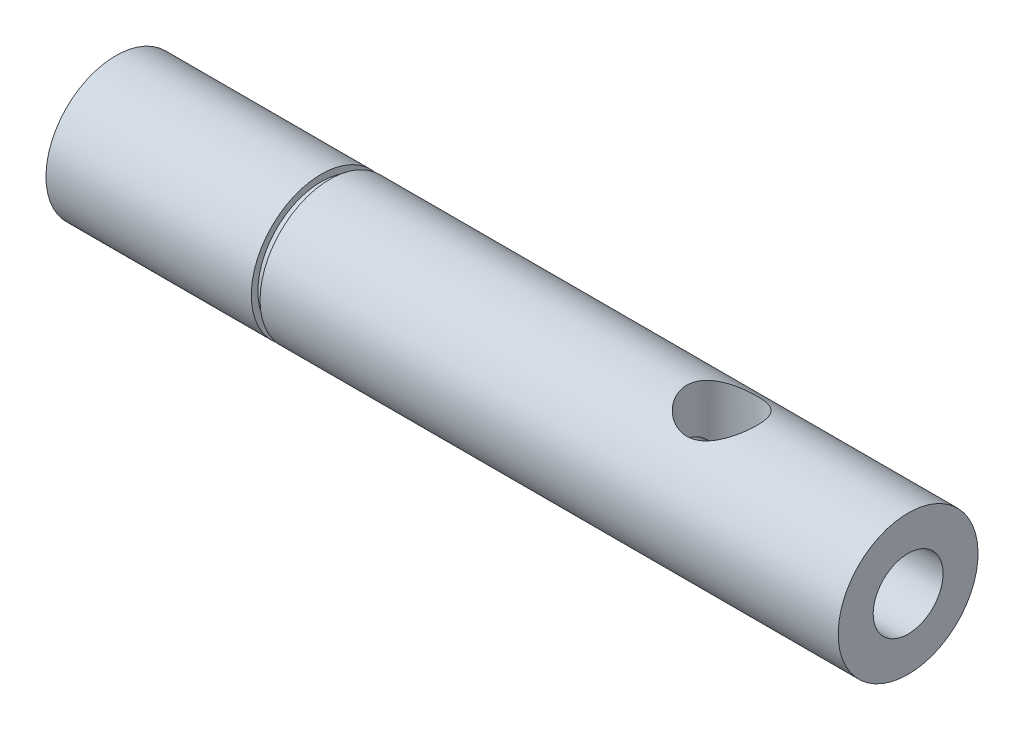
ISO-10303-21;
HEADER;
FILE_DESCRIPTION(('STEP AP214'),'2;1');
FILE_NAME('part.step','',(''),(''),'','','');
FILE_SCHEMA(('AUTOMOTIVE_DESIGN { 1 0 10303 214 1 1 1 1 }'));
ENDSEC;
DATA;
#1=APPLICATION_CONTEXT('core data for automotive mechanical design processes');
#2=APPLICATION_PROTOCOL_DEFINITION('international standard','automotive_design',2000,#1);
#3=PRODUCT_CONTEXT('',#1,'mechanical');
#4=PRODUCT('Part','Part','',(#3));
#5=PRODUCT_RELATED_PRODUCT_CATEGORY('part','',(#4));
#6=PRODUCT_DEFINITION_FORMATION('','',#4);
#7=PRODUCT_DEFINITION_CONTEXT('part definition',#1,'design');
#8=PRODUCT_DEFINITION('design','',#6,#7);
#9=PRODUCT_DEFINITION_SHAPE('','',#8);
#10=(LENGTH_UNIT() NAMED_UNIT(*) SI_UNIT(.MILLI.,.METRE.));
#11=(NAMED_UNIT(*) PLANE_ANGLE_UNIT() SI_UNIT($,.RADIAN.));
#12=(NAMED_UNIT(*) SI_UNIT($,.STERADIAN.) SOLID_ANGLE_UNIT());
#13=UNCERTAINTY_MEASURE_WITH_UNIT(LENGTH_MEASURE(1.E-05),#10,'distance_accuracy_value','');
#14=(GEOMETRIC_REPRESENTATION_CONTEXT(3) GLOBAL_UNCERTAINTY_ASSIGNED_CONTEXT((#13)) GLOBAL_UNIT_ASSIGNED_CONTEXT((#10,
#11,#12)) REPRESENTATION_CONTEXT('',''));
#15=CARTESIAN_POINT('',(0.,0.,0.));
#16=DIRECTION('',(0.,0.,1.));
#17=DIRECTION('',(1.,0.,0.));
#18=AXIS2_PLACEMENT_3D('',#15,#16,#17);
#19=CARTESIAN_POINT('',(-53.975,0.,0.));
#20=DIRECTION('',(-1.,0.,0.));
#21=DIRECTION('',(0.,-1.,0.));
#22=AXIS2_PLACEMENT_3D('',#19,#20,#21);
#23=CYLINDRICAL_SURFACE('',#22,9.52499999999999);
#24=CARTESIAN_POINT('',(53.975,0.,0.));
#25=DIRECTION('',(-1.,0.,0.));
#26=DIRECTION('',(0.,-1.,0.));
#27=AXIS2_PLACEMENT_3D('',#24,#25,#26);
#28=CIRCLE('',#27,9.52499999999999);
#29=CARTESIAN_POINT('',(53.975,-9.52499999999997,0.));
#30=VERTEX_POINT('',#29);
#31=EDGE_CURVE('E155',#30,#30,#28,.T.);
#32=ORIENTED_EDGE('',*,*,#31,.T.);
#33=EDGE_LOOP('',(#32));
#34=FACE_BOUND('',#33,.T.);
#35=CARTESIAN_POINT('',(23.8125,9.525,0.));
#36=CARTESIAN_POINT('',(23.8125004116858,9.5249996206372,-0.125243167799989));
#37=CARTESIAN_POINT('',(23.8174461184591,9.52252400598023,-0.250495089131835));
#38=CARTESIAN_POINT('',(23.8371725066417,9.51268396387998,-0.500076393496526));
#39=CARTESIAN_POINT('',(23.8519574665802,9.50531740964972,-0.624405351393147));
#40=CARTESIAN_POINT('',(23.8912153424522,9.48587193787975,-0.871331001268149));
#41=CARTESIAN_POINT('',(23.915702074272,9.47378630044847,-0.993924963523299));
#42=CARTESIAN_POINT('',(23.9740922656166,9.44520637539277,-1.23637011508467));
#43=CARTESIAN_POINT('',(24.0079995747786,9.42871028557932,-1.35622016139572));
#44=CARTESIAN_POINT('',(24.0847040045351,9.3917969722246,-1.59183120722171));
#45=CARTESIAN_POINT('',(24.1274618877428,9.37139708461428,-1.70760770137533));
#46=CARTESIAN_POINT('',(24.2215499799103,9.3271126718355,-1.93495086483046));
#47=CARTESIAN_POINT('',(24.2728834152011,9.30322683559748,-2.04651593025));
#48=CARTESIAN_POINT('',(24.4390541465706,9.22716144615755,-2.37384489745524));
#49=CARTESIAN_POINT('',(24.5661473115453,9.17053150857179,-2.58250225923314));
#50=CARTESIAN_POINT('',(24.8579690303492,9.04666081910159,-2.98854538583361));
#51=CARTESIAN_POINT('',(25.0245092823491,8.97898540114139,-3.18448556312959));
#52=CARTESIAN_POINT('',(25.3865911067321,8.84205954293001,-3.5469969745544));
#53=CARTESIAN_POINT('',(25.5821545720731,8.77280794740667,-3.71354582861884));
#54=CARTESIAN_POINT('',(26.0151325773848,8.63435408613186,-4.02553537328567));
#55=CARTESIAN_POINT('',(26.2546165492564,8.56557212539103,-4.16833749963763));
#56=CARTESIAN_POINT('',(26.6318219383726,8.47379640254792,-4.35029005345508));
#57=CARTESIAN_POINT('',(26.760600174953,8.44509626519091,-4.40557901885787));
#58=CARTESIAN_POINT('',(27.0233786891223,8.39256904955604,-4.50483773649694));
#59=CARTESIAN_POINT('',(27.1573758204614,8.36873908777994,-4.54881419057648));
#60=CARTESIAN_POINT('',(27.4215156092971,8.32818911059645,-4.62261399582859));
#61=CARTESIAN_POINT('',(27.5514154219076,8.31113119648639,-4.65312214328154));
#62=CARTESIAN_POINT('',(27.8138816871418,8.28290506375683,-4.70318378391281));
#63=CARTESIAN_POINT('',(27.9464466861774,8.27173372047612,-4.72274308921003));
#64=CARTESIAN_POINT('',(28.2130572544552,8.25575723957705,-4.7506165346424));
#65=CARTESIAN_POINT('',(28.3471018829136,8.25094826797976,-4.75893744712047));
#66=CARTESIAN_POINT('',(28.615481819319,8.24790017307781,-4.76421854927813));
#67=CARTESIAN_POINT('',(28.7498170983105,8.24966042295241,-4.76117982286954));
#68=CARTESIAN_POINT('',(29.0014394630534,8.25906842780931,-4.74483797280582));
#69=CARTESIAN_POINT('',(29.1188387327312,8.2659846789569,-4.73280973448219));
#70=CARTESIAN_POINT('',(29.3520633257449,8.28459407928506,-4.70015601149781));
#71=CARTESIAN_POINT('',(29.4678881429293,8.29628872876442,-4.67952782662533));
#72=CARTESIAN_POINT('',(29.8117964051027,8.33800444414717,-4.60506661909893));
#73=CARTESIAN_POINT('',(30.0364867785852,8.37466460391199,-4.53864529577751));
#74=CARTESIAN_POINT('',(30.4763642274573,8.46236620531704,-4.37297035741613));
#75=CARTESIAN_POINT('',(30.6912080350256,8.51372273880604,-4.27298801966147));
#76=CARTESIAN_POINT('',(31.1021375039129,8.62505005190895,-4.04355977442937));
#77=CARTESIAN_POINT('',(31.2982146831728,8.68502469635285,-3.91410063264099));
#78=CARTESIAN_POINT('',(31.6921549310346,8.8160120789406,-3.61029947812719));
#79=CARTESIAN_POINT('',(31.8870920201442,8.88746017331488,-3.43234782914614));
#80=CARTESIAN_POINT('',(32.2456487814701,9.02721381532401,-3.04584295330872));
#81=CARTESIAN_POINT('',(32.4092534865606,9.0955178493011,-2.83727518509306));
#82=CARTESIAN_POINT('',(32.6311653266372,9.19195370403877,-2.49965137796344));
#83=CARTESIAN_POINT('',(32.7025179703174,9.22372787983904,-2.38002127368373));
#84=CARTESIAN_POINT('',(32.834778213682,9.28366556941998,-2.13427687141612));
#85=CARTESIAN_POINT('',(32.8956902164603,9.31183060399966,-2.00816533613018));
#86=CARTESIAN_POINT('',(33.0064099554822,9.36371844925579,-1.75034069526616));
#87=CARTESIAN_POINT('',(33.0562221618151,9.38744304755807,-1.61862987016267));
#88=CARTESIAN_POINT('',(33.1441662378217,9.42974072645533,-1.3505610663951));
#89=CARTESIAN_POINT('',(33.1822994511731,9.4483143996453,-1.21420362433567));
#90=CARTESIAN_POINT('',(33.2437107209177,9.47841891468132,-0.949450109300053));
#91=CARTESIAN_POINT('',(33.2679575138712,9.49040564136937,-0.821329961906907));
#92=CARTESIAN_POINT('',(33.3058846588151,9.50921741531495,-0.563164063018351));
#93=CARTESIAN_POINT('',(33.3195659448694,9.51604291885924,-0.433118482780763));
#94=CARTESIAN_POINT('',(33.336179036958,9.52433687415141,-0.172222200636561));
#95=CARTESIAN_POINT('',(33.3391149583215,9.52580737679104,-0.0413718261918314));
#96=CARTESIAN_POINT('',(33.3342085658102,9.52335444060486,0.220072847166305));
#97=CARTESIAN_POINT('',(33.326366728936,9.5194312404928,0.350667157156415));
#98=CARTESIAN_POINT('',(33.3010395631741,9.50681651861088,0.600383632816321));
#99=CARTESIAN_POINT('',(33.2843520453444,9.49851975936574,0.719607798059647));
#100=CARTESIAN_POINT('',(33.2420838139219,9.47763434053446,0.956123558476323));
#101=CARTESIAN_POINT('',(33.2165002835031,9.46504432155854,1.07341452918894));
#102=CARTESIAN_POINT('',(33.1567129440977,9.43586934009924,1.30523272581463));
#103=CARTESIAN_POINT('',(33.1225117729942,9.41928560017322,1.41976078572846));
#104=CARTESIAN_POINT('',(33.0458176763395,9.38249998161801,1.64542419391327));
#105=CARTESIAN_POINT('',(33.0033215744865,9.36229671724176,1.75655822362735));
#106=CARTESIAN_POINT('',(32.8612997139752,9.29566539786795,2.09007412634844));
#107=CARTESIAN_POINT('',(32.7489114434497,9.24405921515466,2.3061103310862));
#108=CARTESIAN_POINT('',(32.4940115359582,9.13180205397676,2.71685918550571));
#109=CARTESIAN_POINT('',(32.3514870666523,9.07114722574502,2.91156269769227));
#110=CARTESIAN_POINT('',(32.0242051052876,8.93960783885979,3.29452731372962));
#111=CARTESIAN_POINT('',(31.8366747138558,8.868303631423,3.48027815582498));
#112=CARTESIAN_POINT('',(31.4328138133799,8.72786114875584,3.81886460963264));
#113=CARTESIAN_POINT('',(31.2164635473916,8.65872439991558,3.97167745144758));
#114=CARTESIAN_POINT('',(30.8681527356666,8.56092960704944,4.17638881115549));
#115=CARTESIAN_POINT('',(30.7449370419973,8.52864647367417,4.24173741059432));
#116=CARTESIAN_POINT('',(30.492483369008,8.46793790675362,4.36167001930207));
#117=CARTESIAN_POINT('',(30.3632481503419,8.43951072775551,4.41625890421416));
#118=CARTESIAN_POINT('',(30.0996886238527,8.3876228681576,4.51403084118841));
#119=CARTESIAN_POINT('',(29.9653685783981,8.36415813189979,4.55722321448888));
#120=CARTESIAN_POINT('',(29.6925767817094,8.32316235190995,4.63167416627275));
#121=CARTESIAN_POINT('',(29.5541056768868,8.30563038948562,4.66293459251874));
#122=CARTESIAN_POINT('',(29.2876938550876,8.27866590076995,4.71062527640279));
#123=CARTESIAN_POINT('',(29.1600179913282,8.26861751501085,4.72819092555357));
#124=CARTESIAN_POINT('',(28.9033408034732,8.25443000373947,4.75291664228842));
#125=CARTESIAN_POINT('',(28.7743396196761,8.25029025909993,4.76007780009146));
#126=CARTESIAN_POINT('',(28.5161765289331,8.24809207938036,4.76388567177541));
#127=CARTESIAN_POINT('',(28.3870146944407,8.25003150672727,4.76053608147038));
#128=CARTESIAN_POINT('',(28.1296247560546,8.2599055190099,4.7433830792926));
#129=CARTESIAN_POINT('',(28.0013966141529,8.26783985851659,4.72958009537706));
#130=CARTESIAN_POINT('',(27.7591264074435,8.28834856879423,4.69353669139924));
#131=CARTESIAN_POINT('',(27.6449003619582,8.30040666790683,4.67222934629289));
#132=CARTESIAN_POINT('',(27.4187972159845,8.32877048505191,4.62147643847893));
#133=CARTESIAN_POINT('',(27.3069208534093,8.34507751652014,4.59202835912459));
#134=CARTESIAN_POINT('',(26.975831447855,8.3996615585496,4.49189766535447));
#135=CARTESIAN_POINT('',(26.7610055695258,8.44361545117001,4.40940547807409));
#136=CARTESIAN_POINT('',(26.3336147739473,8.54528603634261,4.20916574352958));
#137=CARTESIAN_POINT('',(26.1221714576201,8.60372898549137,4.08942191082136));
#138=CARTESIAN_POINT('',(25.7209631856101,8.72658246261696,3.82024338512735));
#139=CARTESIAN_POINT('',(25.5312095895194,8.79099608593484,3.67079324521366));
#140=CARTESIAN_POINT('',(25.1548507648066,8.92789150982251,3.32520368388597));
#141=CARTESIAN_POINT('',(24.9714295921238,9.00040265167881,3.12559766366326));
#142=CARTESIAN_POINT('',(24.6399039638229,9.13818513010387,2.69626914168463));
#143=CARTESIAN_POINT('',(24.4918185444492,9.20345255422175,2.46653050955161));
#144=CARTESIAN_POINT('',(24.2995795301632,9.29086610240478,2.10268072495819));
#145=CARTESIAN_POINT('',(24.2402991068654,9.31834760006229,1.97763300723183));
#146=CARTESIAN_POINT('',(24.1326008112953,9.36893044835914,1.72211552262134));
#147=CARTESIAN_POINT('',(24.0841776025696,9.39203394996841,1.59164845695407));
#148=CARTESIAN_POINT('',(23.9988609699552,9.43312646132604,1.32654199767926));
#149=CARTESIAN_POINT('',(23.9619423989292,9.45112661821365,1.19191242135596));
#150=CARTESIAN_POINT('',(23.8999989395542,9.48151473751691,0.919388438520275));
#151=CARTESIAN_POINT('',(23.874966785918,9.49390612793916,0.781496080561082));
#152=CARTESIAN_POINT('',(23.8415755082711,9.5104875945448,0.536297175823778));
#153=CARTESIAN_POINT('',(23.8306815546083,9.51592021375587,0.429411583767854));
#154=CARTESIAN_POINT('',(23.8161435237167,9.52317662911679,0.215019489362881));
#155=CARTESIAN_POINT('',(23.812499646595,9.52500032565785,0.107512969957935));
#156=CARTESIAN_POINT('',(23.8125,9.525,0.));
#157=B_SPLINE_CURVE_WITH_KNOTS('',3,(#35,#36,#37,#38,#39,#40,#41,#42,#43,#44,#45,#46,#47,#48,
#49,#50,#51,#52,#53,#54,#55,#56,#57,#58,#59,#60,#61,#62,#63,#64,#65,#66,#67,#68,#69,#70,#71,#72,
#73,#74,#75,#76,#77,#78,#79,#80,#81,#82,#83,#84,#85,#86,#87,#88,#89,#90,#91,#92,#93,#94,#95,#96,
#97,#98,#99,#100,#101,#102,#103,#104,#105,#106,#107,#108,#109,#110,#111,#112,#113,#114,#115,
#116,#117,#118,#119,#120,#121,#122,#123,#124,#125,#126,#127,#128,#129,#130,#131,#132,#133,#134,
#135,#136,#137,#138,#139,#140,#141,#142,#143,#144,#145,#146,#147,#148,#149,#150,#151,#152,#153,
#154,#155,#156),.UNSPECIFIED.,.T.,.F.,(4,2,2,2,2,2,2,2,2,2,2,2,2,2,2,2,2,2,2,2,2,2,2,2,2,2,2,2,
2,2,2,2,2,2,2,2,2,2,2,2,2,2,2,2,2,2,2,2,2,2,2,2,2,2,2,2,2,2,2,2,4),(0.,0.375623418154021,
0.751410280296022,1.12773421934006,1.50421216665563,1.87905550525341,2.25404018794787,
3.00318908218551,3.7976597983107,4.59273287924314,5.4494638936804,5.87811905389961,
6.30651967909289,6.70950847539315,7.11228314445237,7.51481498990845,7.9173084276388,
8.27152461989834,8.62585211283935,9.33399259637595,10.0586277474397,10.7835888844336,
11.6004728904415,12.417746144678,12.8458801890468,13.2738332313566,13.701613616489,
14.1293447666274,14.521651524315,14.913923595397,15.3060454158579,15.698149882404,
16.0597456619957,16.4214560413944,16.7830558344937,17.144794364286,17.8882174899416,
18.6319578135026,19.4487341785404,20.2660733794108,20.6950689367829,21.1238696504806,
21.5523185520335,21.9807010777177,22.3679690015927,22.7551963432537,23.1422875423821,
23.5293628950278,23.8794231642634,24.2295917732494,24.9294696536929,25.6763690993088,
26.4236579446131,27.2617475314397,28.1002876036314,28.5230685284025,28.9456411934233,
29.3672836019069,29.7886679587936,30.1111069020891,30.4335547448008),.UNSPECIFIED.);
#158=CARTESIAN_POINT('',(23.8125,9.525,0.));
#159=VERTEX_POINT('',#158);
#160=EDGE_CURVE('E73',#159,#159,#157,.T.);
#161=ORIENTED_EDGE('',*,*,#160,.T.);
#162=EDGE_LOOP('',(#161));
#163=FACE_BOUND('',#162,.T.);
#164=CARTESIAN_POINT('',(-24.804328250341,0.,0.));
#165=DIRECTION('',(-1.,0.,0.));
#166=DIRECTION('',(0.,0.,1.));
#167=AXIS2_PLACEMENT_3D('',#164,#165,#166);
#168=CIRCLE('',#167,9.52499999999999);
#169=CARTESIAN_POINT('',(-24.804328250341,0.,9.52499999999999));
#170=VERTEX_POINT('',#169);
#171=EDGE_CURVE('E36',#170,#170,#168,.T.);
#172=ORIENTED_EDGE('',*,*,#171,.F.);
#173=EDGE_LOOP('',(#172));
#174=FACE_BOUND('',#173,.T.);
#175=ADVANCED_FACE('F32',(#34,#163,#174),#23,.T.);
#176=CARTESIAN_POINT('',(-53.975,0.,0.));
#177=DIRECTION('',(-1.,0.,0.));
#178=DIRECTION('',(0.,-1.,0.));
#179=AXIS2_PLACEMENT_3D('',#176,#177,#178);
#180=CIRCLE('',#179,9.52499999999999);
#181=CARTESIAN_POINT('',(-53.975,-9.52499999999999,0.));
#182=VERTEX_POINT('',#181);
#183=EDGE_CURVE('E158',#182,#182,#180,.T.);
#184=ORIENTED_EDGE('',*,*,#183,.F.);
#185=EDGE_LOOP('',(#184));
#186=FACE_BOUND('',#185,.T.);
#187=CARTESIAN_POINT('',(-25.995671749659,0.,0.));
#188=DIRECTION('',(1.,0.,0.));
#189=DIRECTION('',(0.,0.,-1.));
#190=AXIS2_PLACEMENT_3D('',#187,#188,#189);
#191=CIRCLE('',#190,9.52499999999999);
#192=CARTESIAN_POINT('',(-25.995671749659,0.,-9.52499999999999));
#193=VERTEX_POINT('',#192);
#194=EDGE_CURVE('E122',#193,#193,#191,.T.);
#195=ORIENTED_EDGE('',*,*,#194,.F.);
#196=EDGE_LOOP('',(#195));
#197=FACE_BOUND('',#196,.T.);
#198=ADVANCED_FACE('F145',(#186,#197),#23,.T.);
#199=CARTESIAN_POINT('',(29.7342764587984,0.,0.));
#200=DIRECTION('',(1.,0.,0.));
#201=DIRECTION('',(0.,1.,0.));
#202=AXIS2_PLACEMENT_3D('',#199,#200,#201);
#203=CONICAL_SURFACE('',#202,3.1560489871095,0.283547192677407);
#204=CARTESIAN_POINT('',(35.2471722198827,0.,0.));
#205=DIRECTION('',(-1.,0.,0.));
#206=DIRECTION('',(0.,-1.,0.));
#207=AXIS2_PLACEMENT_3D('',#204,#205,#206);
#208=CIRCLE('',#207,4.76249999999998);
#209=CARTESIAN_POINT('',(35.2471722198827,-4.76249999999996,0.));
#210=VERTEX_POINT('',#209);
#211=EDGE_CURVE('E178',#210,#210,#208,.T.);
#212=ORIENTED_EDGE('',*,*,#211,.F.);
#213=EDGE_LOOP('',(#212));
#214=FACE_BOUND('',#213,.T.);
#215=CARTESIAN_POINT('',(39.4479523810095,1.90500000000001,5.675418952168));
#216=CARTESIAN_POINT('',(39.0833839699402,1.90500000000001,5.56335238149701));
#217=CARTESIAN_POINT('',(38.7189059062747,1.90500000000001,5.45099078735664));
#218=CARTESIAN_POINT('',(37.9901758863694,1.90500000000001,5.2255275105295));
#219=CARTESIAN_POINT('',(37.625923931806,1.90500000000001,5.11242582242552));
#220=CARTESIAN_POINT('',(36.8972852675453,1.90500000000001,4.88520559377583));
#221=CARTESIAN_POINT('',(36.532898871012,1.90500000000001,4.7710860482483));
#222=CARTESIAN_POINT('',(35.8044736516805,1.90500000000001,4.54174773542037));
#223=CARTESIAN_POINT('',(35.4404348273946,1.90500000000001,4.42652897284892));
#224=CARTESIAN_POINT('',(34.6970660500217,1.90500000000001,4.18970286944218));
#225=CARTESIAN_POINT('',(34.3177554551214,1.905,4.06803468954526));
#226=CARTESIAN_POINT('',(33.5597624971205,1.905,3.82275773990041));
#227=CARTESIAN_POINT('',(33.1810801323385,1.905,3.69914897535505));
#228=CARTESIAN_POINT('',(32.4249369171888,1.905,3.44947108636717));
#229=CARTESIAN_POINT('',(32.047475232879,1.905,3.32340449486433));
#230=CARTESIAN_POINT('',(31.2937714753541,1.905,3.06771209236546));
#231=CARTESIAN_POINT('',(30.9175293604644,1.905,2.93808640445401));
#232=CARTESIAN_POINT('',(30.1705584317701,1.905,2.67501799738224));
#233=CARTESIAN_POINT('',(29.7998119547657,1.905,2.5416259126369));
#234=CARTESIAN_POINT('',(29.2454433777262,1.905,2.3355036981357));
#235=CARTESIAN_POINT('',(29.0607325156475,1.905,2.26570615117599));
#236=CARTESIAN_POINT('',(28.6923272406276,1.905,2.12355705200531));
#237=CARTESIAN_POINT('',(28.5086326610154,1.905,2.05120593386462));
#238=CARTESIAN_POINT('',(28.1453826354971,1.905,1.90421599038398));
#239=CARTESIAN_POINT('',(27.9658065838695,1.905,1.8296282410905));
#240=CARTESIAN_POINT('',(27.6084653726868,1.905,1.67585771323055));
#241=CARTESIAN_POINT('',(27.4307014881007,1.905,1.59667193101724));
#242=CARTESIAN_POINT('',(27.1667163451018,1.905,1.47302778114466));
#243=CARTESIAN_POINT('',(27.0793198857146,1.905,1.43108210718648));
#244=CARTESIAN_POINT('',(26.9055607903302,1.905,1.34510765152192));
#245=CARTESIAN_POINT('',(26.8191980648021,1.905,1.30107905187625));
#246=CARTESIAN_POINT('',(26.6479665460204,1.905,1.21041742063826));
#247=CARTESIAN_POINT('',(26.5630962099177,1.905,1.16378731553104));
#248=CARTESIAN_POINT('',(26.3953631992691,1.905,1.0670638481871));
#249=CARTESIAN_POINT('',(26.3124997752883,1.905,1.01697180652262));
#250=CARTESIAN_POINT('',(26.1976478398343,1.905,0.94287178749351));
#251=CARTESIAN_POINT('',(26.1643858711452,1.905,0.920839383694011));
#252=CARTESIAN_POINT('',(26.0985025785561,1.905,0.875827999737992));
#253=CARTESIAN_POINT('',(26.0658813757336,1.905,0.85284884317854));
#254=CARTESIAN_POINT('',(25.9689415927164,1.905,0.78208891256592));
#255=CARTESIAN_POINT('',(25.9057987545213,1.905,0.732644693887431));
#256=CARTESIAN_POINT('',(25.7838874936522,1.905,0.62703320921973));
#257=CARTESIAN_POINT('',(25.725187471697,1.905,0.570786122616347));
#258=CARTESIAN_POINT('',(25.6175922374278,1.905,0.449541745970817));
#259=CARTESIAN_POINT('',(25.5686323344061,1.905,0.384607332609849));
#260=CARTESIAN_POINT('',(25.5121861755181,1.905,0.283447928265718));
#261=CARTESIAN_POINT('',(25.4968773136716,1.905,0.25166863963163));
#262=CARTESIAN_POINT('',(25.4712163896744,1.905,0.186164288807671));
#263=CARTESIAN_POINT('',(25.4608569604584,1.905,0.152442202781033));
#264=CARTESIAN_POINT('',(25.4461912913993,1.905,0.0832973367466024));
#265=CARTESIAN_POINT('',(25.4419480418602,1.905,0.0478606906524542));
#266=CARTESIAN_POINT('',(25.4403707851938,1.905,-0.0231751666410434));
#267=CARTESIAN_POINT('',(25.4430367318491,1.905,-0.0587743767513716));
#268=CARTESIAN_POINT('',(25.4542165866117,1.905,-0.125081698022917));
#269=CARTESIAN_POINT('',(25.4620750168153,1.905,-0.155905910791619));
#270=CARTESIAN_POINT('',(25.4821405192944,1.905,-0.216084223079866));
#271=CARTESIAN_POINT('',(25.4943499492975,1.905,-0.245437515678704));
#272=CARTESIAN_POINT('',(25.5326539366627,1.905,-0.323874995351017));
#273=CARTESIAN_POINT('',(25.5622883489218,1.905,-0.371212259277352));
#274=CARTESIAN_POINT('',(25.628099583666,1.905,-0.461096163936633));
#275=CARTESIAN_POINT('',(25.6643007757508,1.905,-0.503623968628144));
#276=CARTESIAN_POINT('',(25.758318721048,1.905,-0.603383833824308));
#277=CARTESIAN_POINT('',(25.81843501516,1.905,-0.658415621631233));
#278=CARTESIAN_POINT('',(25.9435416175271,1.905,-0.762710585986766));
#279=CARTESIAN_POINT('',(26.0085434398692,1.905,-0.811959386632965));
#280=CARTESIAN_POINT('',(26.1419599813312,1.905,-0.906524003914822));
#281=CARTESIAN_POINT('',(26.2103942525704,1.905,-0.951811970936987));
#282=CARTESIAN_POINT('',(26.3491719609484,1.905,-1.03912256952883));
#283=CARTESIAN_POINT('',(26.419512942305,1.905,-1.08114915497721));
#284=CARTESIAN_POINT('',(26.5705988500531,1.905,-1.16790541078469));
#285=CARTESIAN_POINT('',(26.6515332279604,1.905,-1.21230339342217));
#286=CARTESIAN_POINT('',(26.8146822764553,1.905,-1.29869052960673));
#287=CARTESIAN_POINT('',(26.896897128196,1.905,-1.34067933831065));
#288=CARTESIAN_POINT('',(27.1450309437799,1.905,-1.46384906201322));
#289=CARTESIAN_POINT('',(27.3123575689127,1.905,-1.54218800818987));
#290=CARTESIAN_POINT('',(27.64962777973,1.905,-1.69398235402837));
#291=CARTESIAN_POINT('',(27.8195764126833,1.905,-1.76742635170087));
#292=CARTESIAN_POINT('',(28.1609462231087,1.905,-1.91064859863944));
#293=CARTESIAN_POINT('',(28.3323669452115,1.905,-1.98042793713333));
#294=CARTESIAN_POINT('',(28.6761550287536,1.905,-2.11721774732));
#295=CARTESIAN_POINT('',(28.8485215835853,1.905,-2.18423025686325));
#296=CARTESIAN_POINT('',(29.1940679820345,1.905,-2.31615696231035));
#297=CARTESIAN_POINT('',(29.3672478841837,1.905,-2.3810710044655));
#298=CARTESIAN_POINT('',(29.8872460005272,1.905,-2.57317018563851));
#299=CARTESIAN_POINT('',(30.234974149169,1.905,-2.69788900467511));
#300=CARTESIAN_POINT('',(30.9514297896453,1.905,-2.94980845090721));
#301=CARTESIAN_POINT('',(31.3202447941933,1.905,-3.0767582385014));
#302=CARTESIAN_POINT('',(32.0590349088636,1.905,-3.32725759939655));
#303=CARTESIAN_POINT('',(32.429010046814,1.905,-3.45080709042879));
#304=CARTESIAN_POINT('',(33.1699973425824,1.905,-3.69549828438634));
#305=CARTESIAN_POINT('',(33.5410099858982,1.905,-3.81663851328509));
#306=CARTESIAN_POINT('',(34.283642578472,1.905,-4.05704376905071));
#307=CARTESIAN_POINT('',(34.6552625293645,1.905,-4.17630879086154));
#308=CARTESIAN_POINT('',(35.394970956731,1.905,-4.4121106329483));
#309=CARTESIAN_POINT('',(35.7630544837278,1.90500000000001,-4.52866299762392));
#310=CARTESIAN_POINT('',(36.499579257703,1.90500000000001,-4.7606356095965));
#311=CARTESIAN_POINT('',(36.8680205059259,1.90500000000001,-4.87605585293928));
#312=CARTESIAN_POINT('',(37.6049122234329,1.90500000000001,-5.10589570801986));
#313=CARTESIAN_POINT('',(37.9733624794728,1.90500000000001,-5.22031600395131));
#314=CARTESIAN_POINT('',(38.7104951761746,1.90500000000001,-5.44839768977707));
#315=CARTESIAN_POINT('',(39.0791776152722,1.90500000000001,-5.56205908472611));
#316=CARTESIAN_POINT('',(39.4479523810095,1.90500000000001,-5.675418952168));
#317=B_SPLINE_CURVE_WITH_KNOTS('',3,(#215,#216,#217,#218,#219,#220,#221,#222,#223,#224,#225,
#226,#227,#228,#229,#230,#231,#232,#233,#234,#235,#236,#237,#238,#239,#240,#241,#242,#243,#244,
#245,#246,#247,#248,#249,#250,#251,#252,#253,#254,#255,#256,#257,#258,#259,#260,#261,#262,#263,
#264,#265,#266,#267,#268,#269,#270,#271,#272,#273,#274,#275,#276,#277,#278,#279,#280,#281,#282,
#283,#284,#285,#286,#287,#288,#289,#290,#291,#292,#293,#294,#295,#296,#297,#298,#299,#300,#301,
#302,#303,#304,#305,#306,#307,#308,#309,#310,#311,#312,#313,#314,#315,#316),.UNSPECIFIED.,.F.,
.F.,(4,2,2,2,2,2,2,2,2,2,2,2,2,2,2,2,2,2,2,2,2,2,2,2,2,2,2,2,2,2,2,2,2,2,2,2,2,2,2,2,2,2,2,2,2,
2,2,2,2,2,4),(0.,1.14421248456555,2.28843335372793,3.43394773077697,4.57945718190566,
5.77449167445294,6.96952296374348,8.1633817635857,9.35719932796549,10.539171705626,
11.1315334451962,11.7237949722382,12.3071087308763,12.8908079199903,13.1816111114805,
13.4723889317494,13.7628459992123,14.0531928755362,14.1728690489138,14.292567622602,
14.5328572120925,14.776304950742,15.0180774402516,15.1235856303652,15.2289362819783,
15.3353643686228,15.4417917433451,15.5368442633457,15.6319483690948,15.7985128835613,
15.9657086653217,16.2095766719162,16.4540386198416,16.7001004943705,16.9458592421577,
17.2227407868545,17.49966186532,18.0537836521437,18.6091540562873,19.1643584453132,
19.7191463370101,20.2739747847285,21.3821774386232,22.5523141219927,23.7224790914757,
24.8933392341044,26.0642025331389,27.2224875929904,28.3807766969627,29.5381989819624,
30.6956135501699),.UNSPECIFIED.);
#318=CARTESIAN_POINT('',(32.0017439677071,1.905,3.30739051667364));
#319=VERTEX_POINT('',#318);
#320=CARTESIAN_POINT('',(29.7342764587984,1.905,2.51627109211924));
#321=VERTEX_POINT('',#320);
#322=EDGE_CURVE('E49',#319,#321,#317,.T.);
#323=ORIENTED_EDGE('',*,*,#322,.F.);
#324=CARTESIAN_POINT('',(31.7891649358937,1.32222560361504,3.51433493208476));
#325=CARTESIAN_POINT('',(31.8200798041428,1.42293391752858,3.48605615656162));
#326=CARTESIAN_POINT('',(31.8535979074305,1.52184878634352,3.45465522595938));
#327=CARTESIAN_POINT('',(31.9247877495049,1.71607664006016,3.38567580467012));
#328=CARTESIAN_POINT('',(31.9624630751994,1.81138641773075,3.34809196534429));
#329=CARTESIAN_POINT('',(32.0923060897611,2.12082629190976,3.21355327273611));
#330=CARTESIAN_POINT('',(32.1910898602151,2.32671168949199,3.10342110458502));
#331=CARTESIAN_POINT('',(32.3425129256242,2.6182263786757,2.91441964193275));
#332=CARTESIAN_POINT('',(32.3936016681532,2.71263128452859,2.84734227504004));
#333=CARTESIAN_POINT('',(32.4956179760018,2.89525666714733,2.70514404257936));
#334=CARTESIAN_POINT('',(32.5465455820907,2.98347885175308,2.63002541283839));
#335=CARTESIAN_POINT('',(32.6822791171508,3.21282941582174,2.41601704776629));
#336=CARTESIAN_POINT('',(32.7657852968801,3.34764998200399,2.26936214163345));
#337=CARTESIAN_POINT('',(32.9223277170108,3.59358646422278,1.95275242521556));
#338=CARTESIAN_POINT('',(32.9953857462844,3.70475195479922,1.78284759397325));
#339=CARTESIAN_POINT('',(33.1114623649398,3.8784060299571,1.45783806379406));
#340=CARTESIAN_POINT('',(33.1575682196357,3.94619417041892,1.30671784671201));
#341=CARTESIAN_POINT('',(33.2160929007044,4.03150267610454,1.071550660636));
#342=CARTESIAN_POINT('',(33.233832286318,4.05721484372911,0.991723362785304));
#343=CARTESIAN_POINT('',(33.2653984709904,4.10280654912402,0.82967973845383));
#344=CARTESIAN_POINT('',(33.2792269514658,4.12268859357653,0.747464455455894));
#345=CARTESIAN_POINT('',(33.3027277956389,4.15639780246119,0.580637563025582));
#346=CARTESIAN_POINT('',(33.3123721035543,4.17018410507132,0.496013712175583));
#347=CARTESIAN_POINT('',(33.3271258218392,4.1912482236296,0.325603063222137));
#348=CARTESIAN_POINT('',(33.3322372560353,4.19852894418562,0.239816801496542));
#349=CARTESIAN_POINT('',(33.3377946827111,4.20644437686773,0.06778177997421));
#350=CARTESIAN_POINT('',(33.3382407333777,4.20707917188228,-0.0184669740408677));
#351=CARTESIAN_POINT('',(33.3344639663315,4.20170045593384,-0.190626784570079));
#352=CARTESIAN_POINT('',(33.3302414664227,4.19568739751266,-0.276537863671379));
#353=CARTESIAN_POINT('',(33.3119792228324,4.16963449886987,-0.515939431051893));
#354=CARTESIAN_POINT('',(33.292779650881,4.14220945265213,-0.668316459380415));
#355=CARTESIAN_POINT('',(33.2410269252964,4.06767710675496,-0.965635544843227));
#356=CARTESIAN_POINT('',(33.2084730073025,4.02056868045782,-1.1105771758644));
#357=CARTESIAN_POINT('',(33.13018665639,3.90591125459035,-1.39825169006603));
#358=CARTESIAN_POINT('',(33.0838224817709,3.83737194147298,-1.54041436675223));
#359=CARTESIAN_POINT('',(32.9817553973552,3.68381699974811,-1.81191262211186));
#360=CARTESIAN_POINT('',(32.9260419388113,3.59878274289019,-1.94123344605926));
#361=CARTESIAN_POINT('',(32.7785425349824,3.36839448311644,-2.24795855142732));
#362=CARTESIAN_POINT('',(32.6826997204378,3.21420345656467,-2.41686404657155));
#363=CARTESIAN_POINT('',(32.5353780521435,2.96421221521024,-2.64672384387927));
#364=CARTESIAN_POINT('',(32.485652853202,2.87771769402085,-2.7194570382287));
#365=CARTESIAN_POINT('',(32.3861193288339,2.69887919446973,-2.85726775198111));
#366=CARTESIAN_POINT('',(32.3363110445004,2.60653756425846,-2.92234831499307));
#367=CARTESIAN_POINT('',(32.2374836682742,2.41574734025254,-3.04530594916391));
#368=CARTESIAN_POINT('',(32.1884721433236,2.31726182996223,-3.10313159471158));
#369=CARTESIAN_POINT('',(32.0928729743353,2.1149588976327,-3.21110167708953));
#370=CARTESIAN_POINT('',(32.046286430731,2.01113909668202,-3.26124264641174));
#371=CARTESIAN_POINT('',(31.962676778484,1.81190781249304,-3.34786577525447));
#372=CARTESIAN_POINT('',(31.9251892806973,1.71709319028335,-3.38527336014469));
#373=CARTESIAN_POINT('',(31.8542674037766,1.523753077352,-3.45401966411441));
#374=CARTESIAN_POINT('',(31.8208345180881,1.42522623670727,-3.48535614953434));
#375=CARTESIAN_POINT('',(31.7592643024911,1.22498326844206,-3.5416954482161));
#376=CARTESIAN_POINT('',(31.7311165293492,1.12327390368306,-3.56671078646167));
#377=CARTESIAN_POINT('',(31.6812340386339,0.916981517862924,-3.61023775473234));
#378=CARTESIAN_POINT('',(31.6594939145921,0.812401001269442,-3.62875487017742));
#379=CARTESIAN_POINT('',(31.6338890909318,0.662128665829619,-3.65030142367359));
#380=CARTESIAN_POINT('',(31.6269546237282,0.617331020849514,-3.65609711962378));
#381=CARTESIAN_POINT('',(31.6144803826382,0.527419165200309,-3.66647378023469));
#382=CARTESIAN_POINT('',(31.6089401045841,0.48230507504804,-3.67105518404064));
#383=CARTESIAN_POINT('',(31.6041261756977,0.437052089823744,-3.6750239266844));
#384=B_SPLINE_CURVE_WITH_KNOTS('',3,(#324,#325,#326,#327,#328,#329,#330,#331,#332,#333,#334,
#335,#336,#337,#338,#339,#340,#341,#342,#343,#344,#345,#346,#347,#348,#349,#350,#351,#352,#353,
#354,#355,#356,#357,#358,#359,#360,#361,#362,#363,#364,#365,#366,#367,#368,#369,#370,#371,#372,
#373,#374,#375,#376,#377,#378,#379,#380,#381,#382,#383),.UNSPECIFIED.,.F.,.F.,(4,2,2,2,2,2,2,2,
2,2,2,2,2,2,2,2,2,2,2,2,2,2,2,2,2,2,2,2,2,4),(0.,0.326948625912172,0.654181586536938,
1.41093367073239,1.79036412261704,2.16968934872254,2.81514961148239,3.45924354592953,
3.97273749126918,4.2296296964559,4.48641128743058,4.74488900067905,5.00325125122448,
5.26161027945404,5.51995172139621,5.98568072759477,6.45143639437887,6.94307112877111,
7.43526434834505,8.17482316972033,8.54496304721395,8.91495521093838,9.28743734973544,
9.66008706958463,9.98561407452207,10.3112606198197,10.6362567644864,10.9609779027249,
11.0980460299028,11.2350645189431),.UNSPECIFIED.);
#385=CARTESIAN_POINT('',(32.0017439677071,1.905,-3.30739051667364));
#386=VERTEX_POINT('',#385);
#387=EDGE_CURVE('E80',#319,#386,#384,.T.);
#388=ORIENTED_EDGE('',*,*,#387,.T.);
#389=CARTESIAN_POINT('',(29.7342764587984,1.905,-2.51627109211924));
#390=VERTEX_POINT('',#389);
#391=EDGE_CURVE('E159',#390,#386,#317,.T.);
#392=ORIENTED_EDGE('',*,*,#391,.F.);
#393=CARTESIAN_POINT('',(29.7342764587984,0.,0.));
#394=DIRECTION('',(-1.,0.,0.));
#395=DIRECTION('',(0.,-1.,0.));
#396=AXIS2_PLACEMENT_3D('',#393,#394,#395);
#397=CIRCLE('',#396,3.1560489871095);
#398=EDGE_CURVE('E177',#390,#321,#397,.T.);
#399=ORIENTED_EDGE('',*,*,#398,.T.);
#400=EDGE_LOOP('',(#323,#388,#392,#399));
#401=FACE_BOUND('',#400,.T.);
#402=ADVANCED_FACE('F150',(#214,#401),#203,.F.);
#403=CARTESIAN_POINT('',(-53.975,0.,0.));
#404=DIRECTION('',(-1.,0.,0.));
#405=DIRECTION('',(0.,-1.,0.));
#406=AXIS2_PLACEMENT_3D('',#403,#404,#405);
#407=CYLINDRICAL_SURFACE('',#406,3.15604898710951);
#408=CARTESIAN_POINT('',(-27.7936529552538,0.,0.));
#409=DIRECTION('',(-1.,0.,0.));
#410=DIRECTION('',(0.,-1.,0.));
#411=AXIS2_PLACEMENT_3D('',#408,#409,#410);
#412=CIRCLE('',#411,3.15604898710951);
#413=CARTESIAN_POINT('',(-27.7936529552538,-3.1560489871095,0.));
#414=VERTEX_POINT('',#413);
#415=EDGE_CURVE('E174',#414,#414,#412,.T.);
#416=ORIENTED_EDGE('',*,*,#415,.T.);
#417=EDGE_LOOP('',(#416));
#418=FACE_BOUND('',#417,.T.);
#419=DIRECTION('',(-1.,0.,0.));
#420=VECTOR('',#419,1.);
#421=CARTESIAN_POINT('',(-53.975,1.90499999999999,-2.51627109211924));
#422=LINE('',#421,#420);
#423=CARTESIAN_POINT('',(24.531513133326,1.905,-2.51627109211924));
#424=VERTEX_POINT('',#423);
#425=EDGE_CURVE('E11',#424,#390,#422,.F.);
#426=ORIENTED_EDGE('',*,*,#425,.F.);
#427=CARTESIAN_POINT('',(24.531513133326,1.905,-2.51627109211924));
#428=CARTESIAN_POINT('',(24.4978350999233,1.97645078889084,-2.46216607515759));
#429=CARTESIAN_POINT('',(24.4638387229463,2.04551449001367,-2.40510241933437));
#430=CARTESIAN_POINT('',(24.3960231324986,2.17862403990944,-2.28523174101274));
#431=CARTESIAN_POINT('',(24.3622040101493,2.24266750665855,-2.22242202236031));
#432=CARTESIAN_POINT('',(24.295312454363,2.36593666876222,-2.09073794006316));
#433=CARTESIAN_POINT('',(24.2622485958918,2.42511775055741,-2.02181738414885));
#434=CARTESIAN_POINT('',(24.197963881371,2.53768015236821,-1.87859513393505));
#435=CARTESIAN_POINT('',(24.1667428064663,2.59106216173583,-1.8042940809842));
#436=CARTESIAN_POINT('',(24.1067911098672,2.69179747955317,-1.65026449807193));
#437=CARTESIAN_POINT('',(24.0780712844826,2.73912503024715,-1.57051485816109));
#438=CARTESIAN_POINT('',(24.0240306060539,2.82697019308758,-1.40625601004956));
#439=CARTESIAN_POINT('',(23.998709232378,2.86748884857508,-1.32174753370964));
#440=CARTESIAN_POINT('',(23.9522634021565,2.94104455639301,-1.14878290201858));
#441=CARTESIAN_POINT('',(23.9311247161413,2.97410703018374,-1.06034143004486));
#442=CARTESIAN_POINT('',(23.8935896827782,3.03238174259246,-0.879935215353459));
#443=CARTESIAN_POINT('',(23.8771923978273,3.05759553334804,-0.787971173296221));
#444=CARTESIAN_POINT('',(23.8513667731459,3.09711869694282,-0.612817969672568));
#445=CARTESIAN_POINT('',(23.8413308890565,3.11238535291717,-0.52993350287456));
#446=CARTESIAN_POINT('',(23.8255982068595,3.13626166926981,-0.362810149395563));
#447=CARTESIAN_POINT('',(23.8199007732057,3.14487230470146,-0.278571462943157));
#448=CARTESIAN_POINT('',(23.8130069944379,3.15528645465068,-0.109475497112404));
#449=CARTESIAN_POINT('',(23.8118111312696,3.15708924030863,-0.0246181524738631));
#450=CARTESIAN_POINT('',(23.8139481351925,3.15386293722219,0.14488222564534));
#451=CARTESIAN_POINT('',(23.8172806733751,3.14883434465709,0.229525274243486));
#452=CARTESIAN_POINT('',(23.8326440647521,3.12559238068695,0.462030218943812));
#453=CARTESIAN_POINT('',(23.8493662393277,3.10025473953864,0.60894964508893));
#454=CARTESIAN_POINT('',(23.8952411673934,3.02986480851654,0.895781276037727));
#455=CARTESIAN_POINT('',(23.9243918750357,2.98481576328423,1.03569462986982));
#456=CARTESIAN_POINT('',(23.9942508347448,2.8747846097524,1.31115390168442));
#457=CARTESIAN_POINT('',(24.0353734307836,2.80907958778355,1.44630347783252));
#458=CARTESIAN_POINT('',(24.1256980276041,2.66063632247884,1.70405979839638));
#459=CARTESIAN_POINT('',(24.1749090179898,2.57787910072949,1.8266523377649));
#460=CARTESIAN_POINT('',(24.2750681659399,2.40282022642618,2.05088413318408));
#461=CARTESIAN_POINT('',(24.3257325260656,2.31139529739242,2.15334120366026));
#462=CARTESIAN_POINT('',(24.4283344035375,2.11677014758703,2.34487314893363));
#463=CARTESIAN_POINT('',(24.4802670654361,2.01361056739418,2.43399187572033));
#464=CARTESIAN_POINT('',(24.531513133326,1.905,2.51627109211924));
#465=B_SPLINE_CURVE_WITH_KNOTS('',3,(#427,#428,#429,#430,#431,#432,#433,#434,#435,#436,#437,
#438,#439,#440,#441,#442,#443,#444,#445,#446,#447,#448,#449,#450,#451,#452,#453,#454,#455,#456,
#457,#458,#459,#460,#461,#462,#463,#464),.UNSPECIFIED.,.F.,.F.,(4,2,2,2,2,2,2,2,2,2,2,2,2,2,2,2,
2,2,4),(0.,0.287158928243486,0.574453294447637,0.864142659112726,1.15379754982097,
1.44464641782616,1.73545067773961,2.02524793971538,2.31498785558561,2.56924343291779,
2.82346175679482,3.07770729693281,3.33193437159823,3.77975776630561,4.22750747371762,
4.69310329484676,5.15922013181788,5.59722340046191,6.03375344218824),.UNSPECIFIED.);
#466=CARTESIAN_POINT('',(24.531513133326,1.905,2.51627109211924));
#467=VERTEX_POINT('',#466);
#468=EDGE_CURVE('E78',#424,#467,#465,.T.);
#469=ORIENTED_EDGE('',*,*,#468,.T.);
#470=DIRECTION('',(-1.,0.,0.));
#471=VECTOR('',#470,1.);
#472=CARTESIAN_POINT('',(-53.975,1.90499999999999,2.51627109211924));
#473=LINE('',#472,#471);
#474=EDGE_CURVE('E41',#321,#467,#473,.T.);
#475=ORIENTED_EDGE('',*,*,#474,.F.);
#476=ORIENTED_EDGE('',*,*,#398,.F.);
#477=EDGE_LOOP('',(#426,#469,#475,#476));
#478=FACE_BOUND('',#477,.T.);
#479=ADVANCED_FACE('F83',(#418,#478),#407,.F.);
#480=CARTESIAN_POINT('',(53.975,9.52500000000001,0.));
#481=DIRECTION('',(-1.,0.,0.));
#482=DIRECTION('',(0.,-1.,0.));
#483=AXIS2_PLACEMENT_3D('',#480,#481,#482);
#484=PLANE('',#483);
#485=ORIENTED_EDGE('',*,*,#31,.F.);
#486=EDGE_LOOP('',(#485));
#487=FACE_BOUND('',#486,.T.);
#488=CARTESIAN_POINT('',(53.975,0.,0.));
#489=DIRECTION('',(-1.,0.,0.));
#490=DIRECTION('',(0.,-1.,0.));
#491=AXIS2_PLACEMENT_3D('',#488,#489,#490);
#492=CIRCLE('',#491,4.76249999999998);
#493=CARTESIAN_POINT('',(53.975,-4.76249999999996,0.));
#494=VERTEX_POINT('',#493);
#495=EDGE_CURVE('E120',#494,#494,#492,.T.);
#496=ORIENTED_EDGE('',*,*,#495,.T.);
#497=EDGE_LOOP('',(#496));
#498=FACE_BOUND('',#497,.T.);
#499=ADVANCED_FACE('F34',(#487,#498),#484,.F.);
#500=CARTESIAN_POINT('',(-53.975,0.,0.));
#501=DIRECTION('',(-1.,0.,0.));
#502=DIRECTION('',(0.,-1.,0.));
#503=AXIS2_PLACEMENT_3D('',#500,#501,#502);
#504=CYLINDRICAL_SURFACE('',#503,4.76249999999998);
#505=ORIENTED_EDGE('',*,*,#495,.F.);
#506=EDGE_LOOP('',(#505));
#507=FACE_BOUND('',#506,.T.);
#508=ORIENTED_EDGE('',*,*,#211,.T.);
#509=EDGE_LOOP('',(#508));
#510=FACE_BOUND('',#509,.T.);
#511=ADVANCED_FACE('F186',(#507,#510),#504,.F.);
#512=CARTESIAN_POINT('',(-35.9403572379995,0.,0.));
#513=DIRECTION('',(-1.,0.,0.));
#514=DIRECTION('',(0.,-1.,0.));
#515=AXIS2_PLACEMENT_3D('',#512,#513,#514);
#516=CONICAL_SURFACE('',#515,6.985,0.43936088728459);
#517=ORIENTED_EDGE('',*,*,#415,.F.);
#518=EDGE_LOOP('',(#517));
#519=FACE_BOUND('',#518,.T.);
#520=CARTESIAN_POINT('',(-35.9403572379995,0.,0.));
#521=DIRECTION('',(-1.,0.,0.));
#522=DIRECTION('',(0.,-1.,0.));
#523=AXIS2_PLACEMENT_3D('',#520,#521,#522);
#524=CIRCLE('',#523,6.985);
#525=CARTESIAN_POINT('',(-35.9403572379995,-6.98499999999999,0.));
#526=VERTEX_POINT('',#525);
#527=EDGE_CURVE('E171',#526,#526,#524,.T.);
#528=ORIENTED_EDGE('',*,*,#527,.T.);
#529=EDGE_LOOP('',(#528));
#530=FACE_BOUND('',#529,.T.);
#531=ADVANCED_FACE('F188',(#519,#530),#516,.F.);
#532=CARTESIAN_POINT('',(-53.975,0.,0.));
#533=DIRECTION('',(-1.,0.,0.));
#534=DIRECTION('',(0.,-1.,0.));
#535=AXIS2_PLACEMENT_3D('',#532,#533,#534);
#536=CYLINDRICAL_SURFACE('',#535,6.985);
#537=ORIENTED_EDGE('',*,*,#527,.F.);
#538=EDGE_LOOP('',(#537));
#539=FACE_BOUND('',#538,.T.);
#540=CARTESIAN_POINT('',(-53.975,0.,0.));
#541=DIRECTION('',(-1.,0.,0.));
#542=DIRECTION('',(0.,-1.,0.));
#543=AXIS2_PLACEMENT_3D('',#540,#541,#542);
#544=CIRCLE('',#543,6.985);
#545=CARTESIAN_POINT('',(-53.975,-6.985,0.));
#546=VERTEX_POINT('',#545);
#547=EDGE_CURVE('E162',#546,#546,#544,.T.);
#548=ORIENTED_EDGE('',*,*,#547,.T.);
#549=EDGE_LOOP('',(#548));
#550=FACE_BOUND('',#549,.T.);
#551=ADVANCED_FACE('F193',(#539,#550),#536,.F.);
#552=CARTESIAN_POINT('',(-53.975,6.985,0.));
#553=DIRECTION('',(1.,0.,0.));
#554=DIRECTION('',(0.,1.,0.));
#555=AXIS2_PLACEMENT_3D('',#552,#553,#554);
#556=PLANE('',#555);
#557=ORIENTED_EDGE('',*,*,#547,.F.);
#558=EDGE_LOOP('',(#557));
#559=FACE_BOUND('',#558,.T.);
#560=ORIENTED_EDGE('',*,*,#183,.T.);
#561=EDGE_LOOP('',(#560));
#562=FACE_BOUND('',#561,.T.);
#563=ADVANCED_FACE('F205',(#559,#562),#556,.F.);
#564=CARTESIAN_POINT('',(28.575,1.905,0.));
#565=DIRECTION('',(0.,1.,0.));
#566=DIRECTION('',(-1.,0.,0.));
#567=AXIS2_PLACEMENT_3D('',#564,#565,#566);
#568=PLANE('',#567);
#569=ORIENTED_EDGE('',*,*,#391,.T.);
#570=CARTESIAN_POINT('',(28.575,1.905,0.));
#571=DIRECTION('',(0.,1.,0.));
#572=DIRECTION('',(-1.,0.,0.));
#573=AXIS2_PLACEMENT_3D('',#570,#571,#572);
#574=CIRCLE('',#573,4.76250000000001);
#575=EDGE_CURVE('E81',#386,#424,#574,.T.);
#576=ORIENTED_EDGE('',*,*,#575,.T.);
#577=ORIENTED_EDGE('',*,*,#425,.T.);
#578=EDGE_LOOP('',(#569,#576,#577));
#579=FACE_BOUND('',#578,.T.);
#580=ADVANCED_FACE('F107',(#579),#568,.T.);
#581=ORIENTED_EDGE('',*,*,#322,.T.);
#582=ORIENTED_EDGE('',*,*,#474,.T.);
#583=EDGE_CURVE('E68',#467,#319,#574,.T.);
#584=ORIENTED_EDGE('',*,*,#583,.T.);
#585=EDGE_LOOP('',(#581,#582,#584));
#586=FACE_BOUND('',#585,.T.);
#587=ADVANCED_FACE('F67',(#586),#568,.T.);
#588=CARTESIAN_POINT('',(28.575,1.905,0.));
#589=DIRECTION('',(0.,1.,0.));
#590=DIRECTION('',(-1.,0.,0.));
#591=AXIS2_PLACEMENT_3D('',#588,#589,#590);
#592=CYLINDRICAL_SURFACE('',#591,4.76250000000001);
#593=ORIENTED_EDGE('',*,*,#160,.F.);
#594=EDGE_LOOP('',(#593));
#595=FACE_BOUND('',#594,.T.);
#596=ORIENTED_EDGE('',*,*,#583,.F.);
#597=ORIENTED_EDGE('',*,*,#468,.F.);
#598=ORIENTED_EDGE('',*,*,#575,.F.);
#599=ORIENTED_EDGE('',*,*,#387,.F.);
#600=EDGE_LOOP('',(#596,#597,#598,#599));
#601=FACE_BOUND('',#600,.T.);
#602=ADVANCED_FACE('F76',(#595,#601),#592,.F.);
#603=CARTESIAN_POINT('',(-24.804328250341,0.,-10.4162890807453));
#604=DIRECTION('',(-1.,0.,0.));
#605=DIRECTION('',(0.,0.,1.));
#606=AXIS2_PLACEMENT_3D('',#603,#604,#605);
#607=PLANE('',#606);
#608=CARTESIAN_POINT('',(-24.804328250341,0.,0.));
#609=DIRECTION('',(-1.,0.,0.));
#610=DIRECTION('',(0.,0.,1.));
#611=AXIS2_PLACEMENT_3D('',#608,#609,#610);
#612=CIRCLE('',#611,8.63371091925465);
#613=CARTESIAN_POINT('',(-24.804328250341,0.,8.63371091925465));
#614=VERTEX_POINT('',#613);
#615=EDGE_CURVE('E129',#614,#614,#612,.T.);
#616=ORIENTED_EDGE('',*,*,#615,.F.);
#617=EDGE_LOOP('',(#616));
#618=FACE_BOUND('',#617,.T.);
#619=ORIENTED_EDGE('',*,*,#171,.T.);
#620=EDGE_LOOP('',(#619));
#621=FACE_BOUND('',#620,.T.);
#622=ADVANCED_FACE('F105',(#618,#621),#607,.T.);
#623=CARTESIAN_POINT('',(-25.995671749659,0.,-10.4162890807453));
#624=DIRECTION('',(1.,0.,0.));
#625=DIRECTION('',(0.,0.,-1.));
#626=AXIS2_PLACEMENT_3D('',#623,#624,#625);
#627=PLANE('',#626);
#628=CARTESIAN_POINT('',(-25.995671749659,0.,0.));
#629=DIRECTION('',(-1.,0.,0.));
#630=DIRECTION('',(0.,0.,1.));
#631=AXIS2_PLACEMENT_3D('',#628,#629,#630);
#632=CIRCLE('',#631,8.63371091925465);
#633=CARTESIAN_POINT('',(-25.995671749659,0.,8.63371091925465));
#634=VERTEX_POINT('',#633);
#635=EDGE_CURVE('E124',#634,#634,#632,.T.);
#636=ORIENTED_EDGE('',*,*,#635,.T.);
#637=EDGE_LOOP('',(#636));
#638=FACE_BOUND('',#637,.T.);
#639=ORIENTED_EDGE('',*,*,#194,.T.);
#640=EDGE_LOOP('',(#639));
#641=FACE_BOUND('',#640,.T.);
#642=ADVANCED_FACE('F141',(#638,#641),#627,.T.);
#643=CARTESIAN_POINT('',(-53.975,0.,0.));
#644=DIRECTION('',(-1.,0.,0.));
#645=DIRECTION('',(0.,0.,1.));
#646=AXIS2_PLACEMENT_3D('',#643,#644,#645);
#647=CYLINDRICAL_SURFACE('',#646,8.63371091925465);
#648=ORIENTED_EDGE('',*,*,#615,.T.);
#649=EDGE_LOOP('',(#648));
#650=FACE_BOUND('',#649,.T.);
#651=ORIENTED_EDGE('',*,*,#635,.F.);
#652=EDGE_LOOP('',(#651));
#653=FACE_BOUND('',#652,.T.);
#654=ADVANCED_FACE('F136',(#650,#653),#647,.T.);
#655=CLOSED_SHELL('',(#175,#198,#402,#479,#499,#511,#531,#551,#563,#580,#587,#602,#622,#642,#654));
#656=MANIFOLD_SOLID_BREP('B2',#655);
#657=ADVANCED_BREP_SHAPE_REPRESENTATION('',(#18,#656),#14);
#658=SHAPE_DEFINITION_REPRESENTATION(#9,#657);
ENDSEC;
END-ISO-10303-21;
